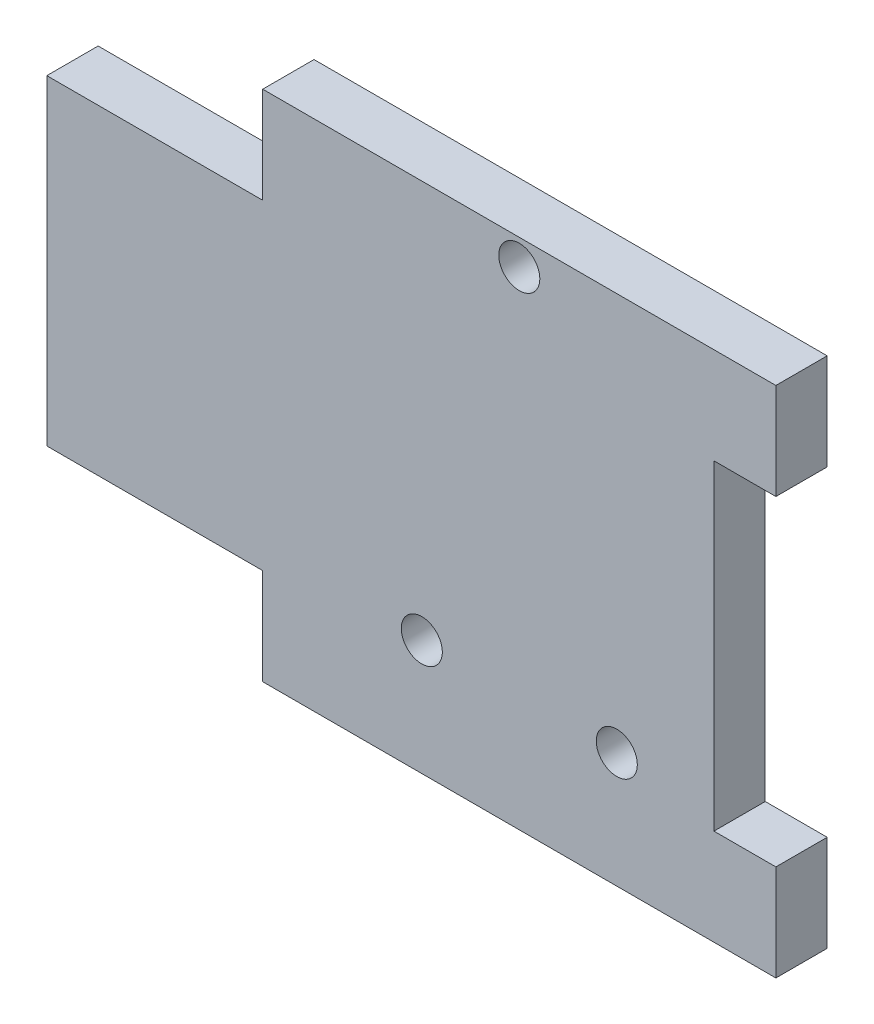
ISO-10303-21;
HEADER;
FILE_DESCRIPTION(('STEP AP214'),'2;1');
FILE_NAME('part.step','',(''),(''),'','','');
FILE_SCHEMA(('AUTOMOTIVE_DESIGN { 1 0 10303 214 1 1 1 1 }'));
ENDSEC;
DATA;
#1=APPLICATION_CONTEXT('core data for automotive mechanical design processes');
#2=APPLICATION_PROTOCOL_DEFINITION('international standard','automotive_design',2000,#1);
#3=PRODUCT_CONTEXT('',#1,'mechanical');
#4=PRODUCT('Part','Part','',(#3));
#5=PRODUCT_RELATED_PRODUCT_CATEGORY('part','',(#4));
#6=PRODUCT_DEFINITION_FORMATION('','',#4);
#7=PRODUCT_DEFINITION_CONTEXT('part definition',#1,'design');
#8=PRODUCT_DEFINITION('design','',#6,#7);
#9=PRODUCT_DEFINITION_SHAPE('','',#8);
#10=(LENGTH_UNIT() NAMED_UNIT(*) SI_UNIT(.MILLI.,.METRE.));
#11=(NAMED_UNIT(*) PLANE_ANGLE_UNIT() SI_UNIT($,.RADIAN.));
#12=(NAMED_UNIT(*) SI_UNIT($,.STERADIAN.) SOLID_ANGLE_UNIT());
#13=UNCERTAINTY_MEASURE_WITH_UNIT(LENGTH_MEASURE(1.E-05),#10,'distance_accuracy_value','');
#14=(GEOMETRIC_REPRESENTATION_CONTEXT(3) GLOBAL_UNCERTAINTY_ASSIGNED_CONTEXT((#13)) GLOBAL_UNIT_ASSIGNED_CONTEXT((#10,
#11,#12)) REPRESENTATION_CONTEXT('',''));
#15=CARTESIAN_POINT('',(0.,0.,0.));
#16=DIRECTION('',(0.,0.,1.));
#17=DIRECTION('',(1.,0.,0.));
#18=AXIS2_PLACEMENT_3D('',#15,#16,#17);
#19=CARTESIAN_POINT('',(0.,0.,4.));
#20=DIRECTION('',(0.,0.,-1.));
#21=DIRECTION('',(-1.,0.,0.));
#22=AXIS2_PLACEMENT_3D('',#19,#20,#21);
#23=PLANE('',#22);
#24=DIRECTION('',(0.,1.,0.));
#25=VECTOR('',#24,1.);
#26=CARTESIAN_POINT('',(20.,-32.5,4.));
#27=LINE('',#26,#25);
#28=CARTESIAN_POINT('',(20.,-40.,4.));
#29=VERTEX_POINT('',#28);
#30=CARTESIAN_POINT('',(20.,-32.5,4.));
#31=VERTEX_POINT('',#30);
#32=EDGE_CURVE('E177',#29,#31,#27,.T.);
#33=ORIENTED_EDGE('',*,*,#32,.T.);
#34=DIRECTION('',(-1.,0.,0.));
#35=VECTOR('',#34,1.);
#36=CARTESIAN_POINT('',(15.1715728752538,-32.5,4.));
#37=LINE('',#36,#35);
#38=CARTESIAN_POINT('',(15.1715728752538,-32.5,4.));
#39=VERTEX_POINT('',#38);
#40=EDGE_CURVE('E105',#31,#39,#37,.T.);
#41=ORIENTED_EDGE('',*,*,#40,.T.);
#42=DIRECTION('',(0.,1.,0.));
#43=VECTOR('',#42,1.);
#44=CARTESIAN_POINT('',(15.1715728752538,-7.5,4.));
#45=LINE('',#44,#43);
#46=CARTESIAN_POINT('',(15.1715728752538,-7.5,4.));
#47=VERTEX_POINT('',#46);
#48=EDGE_CURVE('E204',#39,#47,#45,.T.);
#49=ORIENTED_EDGE('',*,*,#48,.T.);
#50=DIRECTION('',(1.,0.,0.));
#51=VECTOR('',#50,1.);
#52=CARTESIAN_POINT('',(20.,-7.5,4.));
#53=LINE('',#52,#51);
#54=CARTESIAN_POINT('',(20.,-7.5,4.));
#55=VERTEX_POINT('',#54);
#56=EDGE_CURVE('E223',#47,#55,#53,.T.);
#57=ORIENTED_EDGE('',*,*,#56,.T.);
#58=DIRECTION('',(0.,1.,0.));
#59=VECTOR('',#58,1.);
#60=CARTESIAN_POINT('',(20.,0.,4.));
#61=LINE('',#60,#59);
#62=CARTESIAN_POINT('',(20.,0.,4.));
#63=VERTEX_POINT('',#62);
#64=EDGE_CURVE('E220',#55,#63,#61,.T.);
#65=ORIENTED_EDGE('',*,*,#64,.T.);
#66=DIRECTION('',(-1.,0.,0.));
#67=VECTOR('',#66,1.);
#68=CARTESIAN_POINT('',(-20.,0.,4.));
#69=LINE('',#68,#67);
#70=CARTESIAN_POINT('',(-20.,0.,4.));
#71=VERTEX_POINT('',#70);
#72=EDGE_CURVE('E222',#63,#71,#69,.T.);
#73=ORIENTED_EDGE('',*,*,#72,.T.);
#74=DIRECTION('',(0.,-1.,0.));
#75=VECTOR('',#74,1.);
#76=CARTESIAN_POINT('',(-20.,-7.5,4.));
#77=LINE('',#76,#75);
#78=CARTESIAN_POINT('',(-20.,-7.5,4.));
#79=VERTEX_POINT('',#78);
#80=EDGE_CURVE('E225',#71,#79,#77,.T.);
#81=ORIENTED_EDGE('',*,*,#80,.T.);
#82=DIRECTION('',(-1.,0.,0.));
#83=VECTOR('',#82,1.);
#84=CARTESIAN_POINT('',(-20.,-7.5,4.));
#85=LINE('',#84,#83);
#86=CARTESIAN_POINT('',(-36.8284271247462,-7.5,4.));
#87=VERTEX_POINT('',#86);
#88=EDGE_CURVE('E231',#79,#87,#85,.T.);
#89=ORIENTED_EDGE('',*,*,#88,.T.);
#90=DIRECTION('',(0.,-1.,0.));
#91=VECTOR('',#90,1.);
#92=CARTESIAN_POINT('',(-36.8284271247462,-32.5,4.));
#93=LINE('',#92,#91);
#94=CARTESIAN_POINT('',(-36.8284271247462,-32.5,4.));
#95=VERTEX_POINT('',#94);
#96=EDGE_CURVE('E136',#87,#95,#93,.T.);
#97=ORIENTED_EDGE('',*,*,#96,.T.);
#98=DIRECTION('',(1.,0.,0.));
#99=VECTOR('',#98,1.);
#100=CARTESIAN_POINT('',(-20.,-32.5,4.));
#101=LINE('',#100,#99);
#102=CARTESIAN_POINT('',(-20.,-32.5,4.));
#103=VERTEX_POINT('',#102);
#104=EDGE_CURVE('E130',#95,#103,#101,.T.);
#105=ORIENTED_EDGE('',*,*,#104,.T.);
#106=DIRECTION('',(0.,-1.,0.));
#107=VECTOR('',#106,1.);
#108=CARTESIAN_POINT('',(-20.,-40.,4.));
#109=LINE('',#108,#107);
#110=CARTESIAN_POINT('',(-20.,-40.,4.));
#111=VERTEX_POINT('',#110);
#112=EDGE_CURVE('E134',#103,#111,#109,.T.);
#113=ORIENTED_EDGE('',*,*,#112,.T.);
#114=DIRECTION('',(1.,0.,0.));
#115=VECTOR('',#114,1.);
#116=CARTESIAN_POINT('',(20.,-40.,4.));
#117=LINE('',#116,#115);
#118=EDGE_CURVE('E50',#111,#29,#117,.T.);
#119=ORIENTED_EDGE('',*,*,#118,.T.);
#120=EDGE_LOOP('',(#33,#41,#49,#57,#65,#73,#81,#89,#97,#105,#113,#119));
#121=FACE_BOUND('',#120,.T.);
#122=CARTESIAN_POINT('',(7.6,-31.,4.));
#123=DIRECTION('',(0.,0.,1.));
#124=DIRECTION('',(1.,0.,0.));
#125=AXIS2_PLACEMENT_3D('',#122,#123,#124);
#126=CIRCLE('',#125,1.59999999999999);
#127=CARTESIAN_POINT('',(9.19999999999999,-31.,4.));
#128=VERTEX_POINT('',#127);
#129=EDGE_CURVE('E158',#128,#128,#126,.T.);
#130=ORIENTED_EDGE('',*,*,#129,.F.);
#131=EDGE_LOOP('',(#130));
#132=FACE_BOUND('',#131,.T.);
#133=CARTESIAN_POINT('',(-7.6,-31.,4.));
#134=DIRECTION('',(0.,0.,1.));
#135=DIRECTION('',(-1.,0.,0.));
#136=AXIS2_PLACEMENT_3D('',#133,#134,#135);
#137=CIRCLE('',#136,1.6);
#138=CARTESIAN_POINT('',(-9.2,-31.,4.));
#139=VERTEX_POINT('',#138);
#140=EDGE_CURVE('E285',#139,#139,#137,.T.);
#141=ORIENTED_EDGE('',*,*,#140,.F.);
#142=EDGE_LOOP('',(#141));
#143=FACE_BOUND('',#142,.T.);
#144=CARTESIAN_POINT('',(0.,-2.,4.));
#145=DIRECTION('',(0.,0.,1.));
#146=DIRECTION('',(1.,0.,0.));
#147=AXIS2_PLACEMENT_3D('',#144,#145,#146);
#148=CIRCLE('',#147,1.6);
#149=CARTESIAN_POINT('',(1.6,-2.,4.));
#150=VERTEX_POINT('',#149);
#151=EDGE_CURVE('E276',#150,#150,#148,.T.);
#152=ORIENTED_EDGE('',*,*,#151,.F.);
#153=EDGE_LOOP('',(#152));
#154=FACE_BOUND('',#153,.T.);
#155=ADVANCED_FACE('F33',(#121,#132,#143,#154),#23,.F.);
#156=CARTESIAN_POINT('',(0.,0.,0.));
#157=DIRECTION('',(0.,0.,-1.));
#158=DIRECTION('',(-1.,0.,0.));
#159=AXIS2_PLACEMENT_3D('',#156,#157,#158);
#160=PLANE('',#159);
#161=CARTESIAN_POINT('',(-7.6,-31.,0.));
#162=DIRECTION('',(0.,0.,1.));
#163=DIRECTION('',(-1.,0.,0.));
#164=AXIS2_PLACEMENT_3D('',#161,#162,#163);
#165=CIRCLE('',#164,1.6);
#166=CARTESIAN_POINT('',(-9.2,-31.,0.));
#167=VERTEX_POINT('',#166);
#168=EDGE_CURVE('E282',#167,#167,#165,.T.);
#169=ORIENTED_EDGE('',*,*,#168,.T.);
#170=EDGE_LOOP('',(#169));
#171=FACE_BOUND('',#170,.T.);
#172=DIRECTION('',(0.,1.,0.));
#173=VECTOR('',#172,1.);
#174=CARTESIAN_POINT('',(20.,-32.5,0.));
#175=LINE('',#174,#173);
#176=CARTESIAN_POINT('',(20.,-40.,0.));
#177=VERTEX_POINT('',#176);
#178=CARTESIAN_POINT('',(20.,-32.5,0.));
#179=VERTEX_POINT('',#178);
#180=EDGE_CURVE('E154',#177,#179,#175,.T.);
#181=ORIENTED_EDGE('',*,*,#180,.F.);
#182=DIRECTION('',(1.,0.,0.));
#183=VECTOR('',#182,1.);
#184=CARTESIAN_POINT('',(20.,-40.,0.));
#185=LINE('',#184,#183);
#186=CARTESIAN_POINT('',(-20.,-40.,0.));
#187=VERTEX_POINT('',#186);
#188=EDGE_CURVE('E97',#187,#177,#185,.T.);
#189=ORIENTED_EDGE('',*,*,#188,.F.);
#190=DIRECTION('',(0.,-1.,0.));
#191=VECTOR('',#190,1.);
#192=CARTESIAN_POINT('',(-20.,-40.,0.));
#193=LINE('',#192,#191);
#194=CARTESIAN_POINT('',(-20.,-32.5,0.));
#195=VERTEX_POINT('',#194);
#196=EDGE_CURVE('E91',#195,#187,#193,.T.);
#197=ORIENTED_EDGE('',*,*,#196,.F.);
#198=DIRECTION('',(1.,0.,0.));
#199=VECTOR('',#198,1.);
#200=CARTESIAN_POINT('',(-20.,-32.5,0.));
#201=LINE('',#200,#199);
#202=CARTESIAN_POINT('',(-36.8284271247462,-32.5,0.));
#203=VERTEX_POINT('',#202);
#204=EDGE_CURVE('E144',#203,#195,#201,.T.);
#205=ORIENTED_EDGE('',*,*,#204,.F.);
#206=DIRECTION('',(0.,-1.,0.));
#207=VECTOR('',#206,1.);
#208=CARTESIAN_POINT('',(-36.8284271247462,-32.5,0.));
#209=LINE('',#208,#207);
#210=CARTESIAN_POINT('',(-36.8284271247462,-7.5,0.));
#211=VERTEX_POINT('',#210);
#212=EDGE_CURVE('E172',#211,#203,#209,.T.);
#213=ORIENTED_EDGE('',*,*,#212,.F.);
#214=DIRECTION('',(-1.,0.,0.));
#215=VECTOR('',#214,1.);
#216=CARTESIAN_POINT('',(-20.,-7.5,0.));
#217=LINE('',#216,#215);
#218=CARTESIAN_POINT('',(-20.,-7.5,0.));
#219=VERTEX_POINT('',#218);
#220=EDGE_CURVE('E170',#219,#211,#217,.T.);
#221=ORIENTED_EDGE('',*,*,#220,.F.);
#222=DIRECTION('',(0.,-1.,0.));
#223=VECTOR('',#222,1.);
#224=CARTESIAN_POINT('',(-20.,-7.5,0.));
#225=LINE('',#224,#223);
#226=CARTESIAN_POINT('',(-20.,0.,0.));
#227=VERTEX_POINT('',#226);
#228=EDGE_CURVE('E168',#227,#219,#225,.T.);
#229=ORIENTED_EDGE('',*,*,#228,.F.);
#230=DIRECTION('',(-1.,0.,0.));
#231=VECTOR('',#230,1.);
#232=CARTESIAN_POINT('',(-20.,0.,0.));
#233=LINE('',#232,#231);
#234=CARTESIAN_POINT('',(20.,0.,0.));
#235=VERTEX_POINT('',#234);
#236=EDGE_CURVE('E166',#235,#227,#233,.T.);
#237=ORIENTED_EDGE('',*,*,#236,.F.);
#238=DIRECTION('',(0.,1.,0.));
#239=VECTOR('',#238,1.);
#240=CARTESIAN_POINT('',(20.,0.,0.));
#241=LINE('',#240,#239);
#242=CARTESIAN_POINT('',(20.,-7.5,0.));
#243=VERTEX_POINT('',#242);
#244=EDGE_CURVE('E164',#243,#235,#241,.T.);
#245=ORIENTED_EDGE('',*,*,#244,.F.);
#246=DIRECTION('',(1.,0.,0.));
#247=VECTOR('',#246,1.);
#248=CARTESIAN_POINT('',(20.,-7.5,0.));
#249=LINE('',#248,#247);
#250=CARTESIAN_POINT('',(15.1715728752538,-7.5,0.));
#251=VERTEX_POINT('',#250);
#252=EDGE_CURVE('E162',#251,#243,#249,.T.);
#253=ORIENTED_EDGE('',*,*,#252,.F.);
#254=DIRECTION('',(0.,1.,0.));
#255=VECTOR('',#254,1.);
#256=CARTESIAN_POINT('',(15.1715728752538,-7.5,0.));
#257=LINE('',#256,#255);
#258=CARTESIAN_POINT('',(15.1715728752538,-32.5,0.));
#259=VERTEX_POINT('',#258);
#260=EDGE_CURVE('E160',#259,#251,#257,.T.);
#261=ORIENTED_EDGE('',*,*,#260,.F.);
#262=DIRECTION('',(-1.,0.,0.));
#263=VECTOR('',#262,1.);
#264=CARTESIAN_POINT('',(15.1715728752538,-32.5,0.));
#265=LINE('',#264,#263);
#266=EDGE_CURVE('E157',#179,#259,#265,.T.);
#267=ORIENTED_EDGE('',*,*,#266,.F.);
#268=EDGE_LOOP('',(#181,#189,#197,#205,#213,#221,#229,#237,#245,#253,#261,#267));
#269=FACE_BOUND('',#268,.T.);
#270=CARTESIAN_POINT('',(7.6,-31.,0.));
#271=DIRECTION('',(0.,0.,1.));
#272=DIRECTION('',(1.,0.,0.));
#273=AXIS2_PLACEMENT_3D('',#270,#271,#272);
#274=CIRCLE('',#273,1.59999999999999);
#275=CARTESIAN_POINT('',(9.19999999999999,-31.,0.));
#276=VERTEX_POINT('',#275);
#277=EDGE_CURVE('E288',#276,#276,#274,.T.);
#278=ORIENTED_EDGE('',*,*,#277,.T.);
#279=EDGE_LOOP('',(#278));
#280=FACE_BOUND('',#279,.T.);
#281=CARTESIAN_POINT('',(0.,-2.,0.));
#282=DIRECTION('',(0.,0.,1.));
#283=DIRECTION('',(1.,0.,0.));
#284=AXIS2_PLACEMENT_3D('',#281,#282,#283);
#285=CIRCLE('',#284,1.6);
#286=CARTESIAN_POINT('',(1.6,-2.,0.));
#287=VERTEX_POINT('',#286);
#288=EDGE_CURVE('E279',#287,#287,#285,.T.);
#289=ORIENTED_EDGE('',*,*,#288,.T.);
#290=EDGE_LOOP('',(#289));
#291=FACE_BOUND('',#290,.T.);
#292=ADVANCED_FACE('F208',(#171,#269,#280,#291),#160,.T.);
#293=CARTESIAN_POINT('',(20.,-32.5,4.));
#294=DIRECTION('',(-1.,0.,0.));
#295=DIRECTION('',(0.,0.,1.));
#296=AXIS2_PLACEMENT_3D('',#293,#294,#295);
#297=PLANE('',#296);
#298=ORIENTED_EDGE('',*,*,#180,.T.);
#299=DIRECTION('',(0.,0.,-1.));
#300=VECTOR('',#299,1.);
#301=CARTESIAN_POINT('',(20.,-32.5,4.));
#302=LINE('',#301,#300);
#303=EDGE_CURVE('E11',#31,#179,#302,.T.);
#304=ORIENTED_EDGE('',*,*,#303,.F.);
#305=ORIENTED_EDGE('',*,*,#32,.F.);
#306=DIRECTION('',(0.,0.,-1.));
#307=VECTOR('',#306,1.);
#308=CARTESIAN_POINT('',(20.,-40.,4.));
#309=LINE('',#308,#307);
#310=EDGE_CURVE('E150',#29,#177,#309,.T.);
#311=ORIENTED_EDGE('',*,*,#310,.T.);
#312=EDGE_LOOP('',(#298,#304,#305,#311));
#313=FACE_BOUND('',#312,.T.);
#314=ADVANCED_FACE('F35',(#313),#297,.F.);
#315=CARTESIAN_POINT('',(15.1715728752538,-32.5,4.));
#316=DIRECTION('',(0.,-1.,0.));
#317=DIRECTION('',(0.,0.,-1.));
#318=AXIS2_PLACEMENT_3D('',#315,#316,#317);
#319=PLANE('',#318);
#320=ORIENTED_EDGE('',*,*,#266,.T.);
#321=DIRECTION('',(0.,0.,-1.));
#322=VECTOR('',#321,1.);
#323=CARTESIAN_POINT('',(15.1715728752538,-32.5,4.));
#324=LINE('',#323,#322);
#325=EDGE_CURVE('E42',#39,#259,#324,.T.);
#326=ORIENTED_EDGE('',*,*,#325,.F.);
#327=ORIENTED_EDGE('',*,*,#40,.F.);
#328=ORIENTED_EDGE('',*,*,#303,.T.);
#329=EDGE_LOOP('',(#320,#326,#327,#328));
#330=FACE_BOUND('',#329,.T.);
#331=ADVANCED_FACE('F391',(#330),#319,.F.);
#332=CARTESIAN_POINT('',(15.1715728752538,-7.5,4.));
#333=DIRECTION('',(-1.,0.,0.));
#334=DIRECTION('',(0.,-1.,0.));
#335=AXIS2_PLACEMENT_3D('',#332,#333,#334);
#336=PLANE('',#335);
#337=ORIENTED_EDGE('',*,*,#260,.T.);
#338=DIRECTION('',(0.,0.,-1.));
#339=VECTOR('',#338,1.);
#340=CARTESIAN_POINT('',(15.1715728752538,-7.5,4.));
#341=LINE('',#340,#339);
#342=EDGE_CURVE('E196',#47,#251,#341,.T.);
#343=ORIENTED_EDGE('',*,*,#342,.F.);
#344=ORIENTED_EDGE('',*,*,#48,.F.);
#345=ORIENTED_EDGE('',*,*,#325,.T.);
#346=EDGE_LOOP('',(#337,#343,#344,#345));
#347=FACE_BOUND('',#346,.T.);
#348=ADVANCED_FACE('F202',(#347),#336,.F.);
#349=CARTESIAN_POINT('',(20.,-7.5,4.));
#350=DIRECTION('',(0.,1.,0.));
#351=DIRECTION('',(0.,0.,1.));
#352=AXIS2_PLACEMENT_3D('',#349,#350,#351);
#353=PLANE('',#352);
#354=ORIENTED_EDGE('',*,*,#252,.T.);
#355=DIRECTION('',(0.,0.,-1.));
#356=VECTOR('',#355,1.);
#357=CARTESIAN_POINT('',(20.,-7.5,4.));
#358=LINE('',#357,#356);
#359=EDGE_CURVE('E193',#55,#243,#358,.T.);
#360=ORIENTED_EDGE('',*,*,#359,.F.);
#361=ORIENTED_EDGE('',*,*,#56,.F.);
#362=ORIENTED_EDGE('',*,*,#342,.T.);
#363=EDGE_LOOP('',(#354,#360,#361,#362));
#364=FACE_BOUND('',#363,.T.);
#365=ADVANCED_FACE('F214',(#364),#353,.F.);
#366=CARTESIAN_POINT('',(20.,0.,4.));
#367=DIRECTION('',(-1.,0.,0.));
#368=DIRECTION('',(0.,0.,1.));
#369=AXIS2_PLACEMENT_3D('',#366,#367,#368);
#370=PLANE('',#369);
#371=ORIENTED_EDGE('',*,*,#244,.T.);
#372=DIRECTION('',(0.,0.,-1.));
#373=VECTOR('',#372,1.);
#374=CARTESIAN_POINT('',(20.,0.,4.));
#375=LINE('',#374,#373);
#376=EDGE_CURVE('E190',#63,#235,#375,.T.);
#377=ORIENTED_EDGE('',*,*,#376,.F.);
#378=ORIENTED_EDGE('',*,*,#64,.F.);
#379=ORIENTED_EDGE('',*,*,#359,.T.);
#380=EDGE_LOOP('',(#371,#377,#378,#379));
#381=FACE_BOUND('',#380,.T.);
#382=ADVANCED_FACE('F218',(#381),#370,.F.);
#383=CARTESIAN_POINT('',(-20.,0.,4.));
#384=DIRECTION('',(0.,-1.,0.));
#385=DIRECTION('',(1.,0.,0.));
#386=AXIS2_PLACEMENT_3D('',#383,#384,#385);
#387=PLANE('',#386);
#388=ORIENTED_EDGE('',*,*,#236,.T.);
#389=DIRECTION('',(0.,0.,-1.));
#390=VECTOR('',#389,1.);
#391=CARTESIAN_POINT('',(-20.,0.,4.));
#392=LINE('',#391,#390);
#393=EDGE_CURVE('E187',#71,#227,#392,.T.);
#394=ORIENTED_EDGE('',*,*,#393,.F.);
#395=ORIENTED_EDGE('',*,*,#72,.F.);
#396=ORIENTED_EDGE('',*,*,#376,.T.);
#397=EDGE_LOOP('',(#388,#394,#395,#396));
#398=FACE_BOUND('',#397,.T.);
#399=ADVANCED_FACE('F356',(#398),#387,.F.);
#400=CARTESIAN_POINT('',(-20.,-7.5,4.));
#401=DIRECTION('',(1.,0.,0.));
#402=DIRECTION('',(0.,0.,-1.));
#403=AXIS2_PLACEMENT_3D('',#400,#401,#402);
#404=PLANE('',#403);
#405=ORIENTED_EDGE('',*,*,#228,.T.);
#406=DIRECTION('',(0.,0.,-1.));
#407=VECTOR('',#406,1.);
#408=CARTESIAN_POINT('',(-20.,-7.5,4.));
#409=LINE('',#408,#407);
#410=EDGE_CURVE('E184',#79,#219,#409,.T.);
#411=ORIENTED_EDGE('',*,*,#410,.F.);
#412=ORIENTED_EDGE('',*,*,#80,.F.);
#413=ORIENTED_EDGE('',*,*,#393,.T.);
#414=EDGE_LOOP('',(#405,#411,#412,#413));
#415=FACE_BOUND('',#414,.T.);
#416=ADVANCED_FACE('F347',(#415),#404,.F.);
#417=CARTESIAN_POINT('',(-20.,-7.5,4.));
#418=DIRECTION('',(0.,-1.,0.));
#419=DIRECTION('',(0.,0.,-1.));
#420=AXIS2_PLACEMENT_3D('',#417,#418,#419);
#421=PLANE('',#420);
#422=ORIENTED_EDGE('',*,*,#220,.T.);
#423=DIRECTION('',(0.,0.,-1.));
#424=VECTOR('',#423,1.);
#425=CARTESIAN_POINT('',(-36.8284271247462,-7.5,4.));
#426=LINE('',#425,#424);
#427=EDGE_CURVE('E181',#87,#211,#426,.T.);
#428=ORIENTED_EDGE('',*,*,#427,.F.);
#429=ORIENTED_EDGE('',*,*,#88,.F.);
#430=ORIENTED_EDGE('',*,*,#410,.T.);
#431=EDGE_LOOP('',(#422,#428,#429,#430));
#432=FACE_BOUND('',#431,.T.);
#433=ADVANCED_FACE('F237',(#432),#421,.F.);
#434=CARTESIAN_POINT('',(-36.8284271247462,-32.5,4.));
#435=DIRECTION('',(1.,0.,0.));
#436=DIRECTION('',(0.,0.,-1.));
#437=AXIS2_PLACEMENT_3D('',#434,#435,#436);
#438=PLANE('',#437);
#439=ORIENTED_EDGE('',*,*,#212,.T.);
#440=DIRECTION('',(0.,0.,-1.));
#441=VECTOR('',#440,1.);
#442=CARTESIAN_POINT('',(-36.8284271247462,-32.5,4.));
#443=LINE('',#442,#441);
#444=EDGE_CURVE('E145',#95,#203,#443,.T.);
#445=ORIENTED_EDGE('',*,*,#444,.F.);
#446=ORIENTED_EDGE('',*,*,#96,.F.);
#447=ORIENTED_EDGE('',*,*,#427,.T.);
#448=EDGE_LOOP('',(#439,#445,#446,#447));
#449=FACE_BOUND('',#448,.T.);
#450=ADVANCED_FACE('F241',(#449),#438,.F.);
#451=CARTESIAN_POINT('',(-20.,-32.5,4.));
#452=DIRECTION('',(0.,1.,0.));
#453=DIRECTION('',(0.,0.,1.));
#454=AXIS2_PLACEMENT_3D('',#451,#452,#453);
#455=PLANE('',#454);
#456=ORIENTED_EDGE('',*,*,#204,.T.);
#457=DIRECTION('',(0.,0.,-1.));
#458=VECTOR('',#457,1.);
#459=CARTESIAN_POINT('',(-20.,-32.5,4.));
#460=LINE('',#459,#458);
#461=EDGE_CURVE('E141',#103,#195,#460,.T.);
#462=ORIENTED_EDGE('',*,*,#461,.F.);
#463=ORIENTED_EDGE('',*,*,#104,.F.);
#464=ORIENTED_EDGE('',*,*,#444,.T.);
#465=EDGE_LOOP('',(#456,#462,#463,#464));
#466=FACE_BOUND('',#465,.T.);
#467=ADVANCED_FACE('F142',(#466),#455,.F.);
#468=CARTESIAN_POINT('',(-20.,-40.,4.));
#469=DIRECTION('',(1.,0.,0.));
#470=DIRECTION('',(0.,0.,-1.));
#471=AXIS2_PLACEMENT_3D('',#468,#469,#470);
#472=PLANE('',#471);
#473=ORIENTED_EDGE('',*,*,#196,.T.);
#474=DIRECTION('',(0.,0.,-1.));
#475=VECTOR('',#474,1.);
#476=CARTESIAN_POINT('',(-20.,-40.,4.));
#477=LINE('',#476,#475);
#478=EDGE_CURVE('E146',#111,#187,#477,.T.);
#479=ORIENTED_EDGE('',*,*,#478,.F.);
#480=ORIENTED_EDGE('',*,*,#112,.F.);
#481=ORIENTED_EDGE('',*,*,#461,.T.);
#482=EDGE_LOOP('',(#473,#479,#480,#481));
#483=FACE_BOUND('',#482,.T.);
#484=ADVANCED_FACE('F148',(#483),#472,.F.);
#485=CARTESIAN_POINT('',(20.,-40.,4.));
#486=DIRECTION('',(0.,1.,0.));
#487=DIRECTION('',(0.,0.,1.));
#488=AXIS2_PLACEMENT_3D('',#485,#486,#487);
#489=PLANE('',#488);
#490=ORIENTED_EDGE('',*,*,#188,.T.);
#491=ORIENTED_EDGE('',*,*,#310,.F.);
#492=ORIENTED_EDGE('',*,*,#118,.F.);
#493=ORIENTED_EDGE('',*,*,#478,.T.);
#494=EDGE_LOOP('',(#490,#491,#492,#493));
#495=FACE_BOUND('',#494,.T.);
#496=ADVANCED_FACE('F245',(#495),#489,.F.);
#497=CARTESIAN_POINT('',(7.6,-31.,4.));
#498=DIRECTION('',(0.,0.,-1.));
#499=DIRECTION('',(-1.,0.,0.));
#500=AXIS2_PLACEMENT_3D('',#497,#498,#499);
#501=CYLINDRICAL_SURFACE('',#500,1.59999999999999);
#502=ORIENTED_EDGE('',*,*,#129,.T.);
#503=EDGE_LOOP('',(#502));
#504=FACE_BOUND('',#503,.T.);
#505=ORIENTED_EDGE('',*,*,#277,.F.);
#506=EDGE_LOOP('',(#505));
#507=FACE_BOUND('',#506,.T.);
#508=ADVANCED_FACE('F247',(#504,#507),#501,.F.);
#509=CARTESIAN_POINT('',(-7.6,-31.,4.));
#510=DIRECTION('',(0.,0.,-1.));
#511=DIRECTION('',(-1.,0.,0.));
#512=AXIS2_PLACEMENT_3D('',#509,#510,#511);
#513=CYLINDRICAL_SURFACE('',#512,1.6);
#514=ORIENTED_EDGE('',*,*,#140,.T.);
#515=EDGE_LOOP('',(#514));
#516=FACE_BOUND('',#515,.T.);
#517=ORIENTED_EDGE('',*,*,#168,.F.);
#518=EDGE_LOOP('',(#517));
#519=FACE_BOUND('',#518,.T.);
#520=ADVANCED_FACE('F253',(#516,#519),#513,.F.);
#521=CARTESIAN_POINT('',(0.,-2.,4.));
#522=DIRECTION('',(0.,0.,-1.));
#523=DIRECTION('',(-1.,0.,0.));
#524=AXIS2_PLACEMENT_3D('',#521,#522,#523);
#525=CYLINDRICAL_SURFACE('',#524,1.6);
#526=ORIENTED_EDGE('',*,*,#151,.T.);
#527=EDGE_LOOP('',(#526));
#528=FACE_BOUND('',#527,.T.);
#529=ORIENTED_EDGE('',*,*,#288,.F.);
#530=EDGE_LOOP('',(#529));
#531=FACE_BOUND('',#530,.T.);
#532=ADVANCED_FACE('F267',(#528,#531),#525,.F.);
#533=CLOSED_SHELL('',(#155,#292,#314,#331,#348,#365,#382,#399,#416,#433,#450,#467,#484,#496,
#508,#520,#532));
#534=MANIFOLD_SOLID_BREP('B2',#533);
#535=ADVANCED_BREP_SHAPE_REPRESENTATION('',(#18,#534),#14);
#536=SHAPE_DEFINITION_REPRESENTATION(#9,#535);
ENDSEC;
END-ISO-10303-21;
